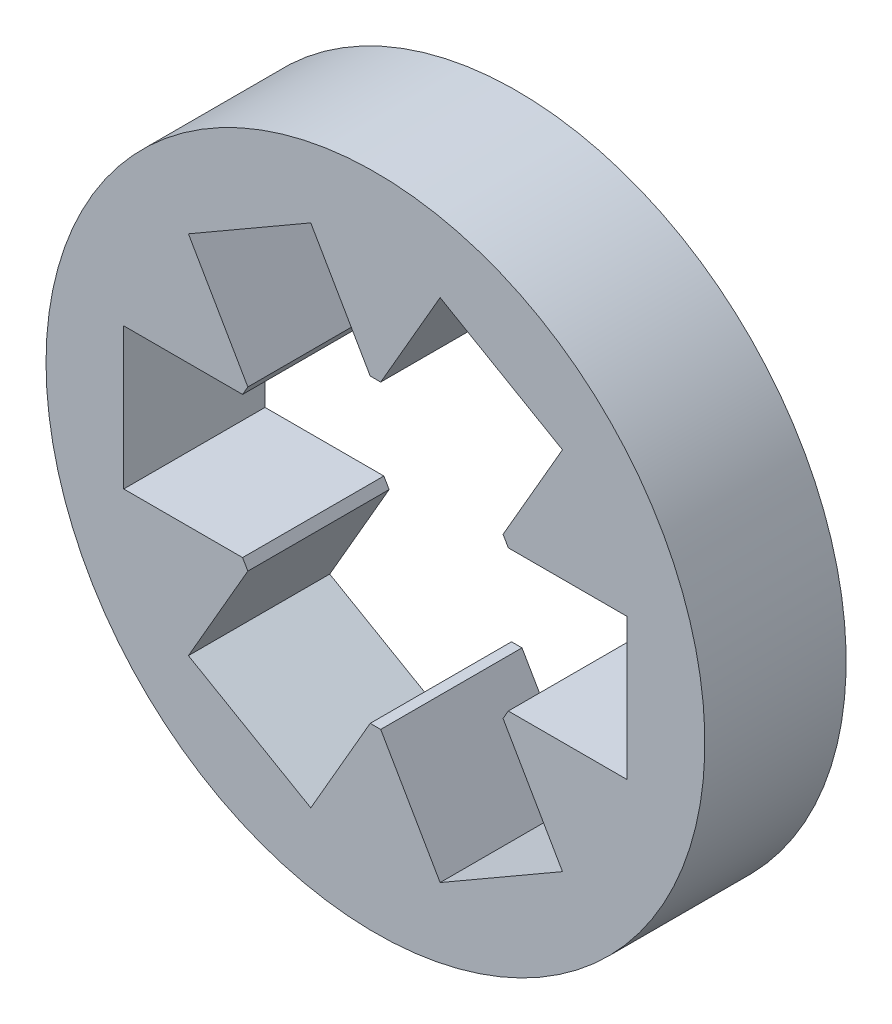
ISO-10303-21;
HEADER;
FILE_DESCRIPTION(('STEP AP214'),'2;1');
FILE_NAME('part.step','',(''),(''),'','','');
FILE_SCHEMA(('AUTOMOTIVE_DESIGN { 1 0 10303 214 1 1 1 1 }'));
ENDSEC;
DATA;
#1=APPLICATION_CONTEXT('core data for automotive mechanical design processes');
#2=APPLICATION_PROTOCOL_DEFINITION('international standard','automotive_design',2000,#1);
#3=PRODUCT_CONTEXT('',#1,'mechanical');
#4=PRODUCT('Part','Part','',(#3));
#5=PRODUCT_RELATED_PRODUCT_CATEGORY('part','',(#4));
#6=PRODUCT_DEFINITION_FORMATION('','',#4);
#7=PRODUCT_DEFINITION_CONTEXT('part definition',#1,'design');
#8=PRODUCT_DEFINITION('design','',#6,#7);
#9=PRODUCT_DEFINITION_SHAPE('','',#8);
#10=(LENGTH_UNIT() NAMED_UNIT(*) SI_UNIT(.MILLI.,.METRE.));
#11=(NAMED_UNIT(*) PLANE_ANGLE_UNIT() SI_UNIT($,.RADIAN.));
#12=(NAMED_UNIT(*) SI_UNIT($,.STERADIAN.) SOLID_ANGLE_UNIT());
#13=UNCERTAINTY_MEASURE_WITH_UNIT(LENGTH_MEASURE(1.E-05),#10,'distance_accuracy_value','');
#14=(GEOMETRIC_REPRESENTATION_CONTEXT(3) GLOBAL_UNCERTAINTY_ASSIGNED_CONTEXT((#13)) GLOBAL_UNIT_ASSIGNED_CONTEXT((#10,
#11,#12)) REPRESENTATION_CONTEXT('',''));
#15=CARTESIAN_POINT('',(0.,0.,0.));
#16=DIRECTION('',(0.,0.,1.));
#17=DIRECTION('',(1.,0.,0.));
#18=AXIS2_PLACEMENT_3D('',#15,#16,#17);
#19=CARTESIAN_POINT('',(107.492585866147,-0.762000000000165,1.524));
#20=DIRECTION('',(0.,0.,1.));
#21=DIRECTION('',(1.,0.,0.));
#22=AXIS2_PLACEMENT_3D('',#19,#20,#21);
#23=PLANE('',#22);
#24=CARTESIAN_POINT('',(107.492585866147,-0.762000000000165,1.524));
#25=DIRECTION('',(0.,0.,1.));
#26=DIRECTION('',(1.,0.,0.));
#27=AXIS2_PLACEMENT_3D('',#24,#25,#26);
#28=CIRCLE('',#27,3.55352076683496);
#29=CARTESIAN_POINT('',(103.939065099312,-0.762000000000165,1.524));
#30=VERTEX_POINT('',#29);
#31=EDGE_CURVE('E11',#30,#30,#28,.T.);
#32=ORIENTED_EDGE('',*,*,#31,.T.);
#33=EDGE_LOOP('',(#32));
#34=FACE_BOUND('',#33,.T.);
#35=DIRECTION('',(-0.500000000001559,0.866025403783539,0.));
#36=VECTOR('',#35,1.);
#37=CARTESIAN_POINT('',(108.869130968628,0.0982460564084853,1.524));
#38=LINE('',#37,#36);
#39=CARTESIAN_POINT('',(108.925853355743,0.,1.524));
#40=VERTEX_POINT('',#39);
#41=CARTESIAN_POINT('',(108.869130968628,0.0982460564084853,1.524));
#42=VERTEX_POINT('',#41);
#43=EDGE_CURVE('E199',#40,#42,#38,.T.);
#44=ORIENTED_EDGE('',*,*,#43,.F.);
#45=DIRECTION('',(-1.,0.,0.));
#46=VECTOR('',#45,1.);
#47=CARTESIAN_POINT('',(108.925853355743,0.,1.524));
#48=LINE('',#47,#46);
#49=CARTESIAN_POINT('',(110.207675722449,0.,1.524));
#50=VERTEX_POINT('',#49);
#51=EDGE_CURVE('E191',#50,#40,#48,.T.);
#52=ORIENTED_EDGE('',*,*,#51,.F.);
#53=DIRECTION('',(0.,1.,0.));
#54=VECTOR('',#53,1.);
#55=CARTESIAN_POINT('',(110.207675722449,0.,1.524));
#56=LINE('',#55,#54);
#57=CARTESIAN_POINT('',(110.207675722449,-1.52399999999999,1.524));
#58=VERTEX_POINT('',#57);
#59=EDGE_CURVE('E255',#58,#50,#56,.T.);
#60=ORIENTED_EDGE('',*,*,#59,.F.);
#61=DIRECTION('',(1.,0.,0.));
#62=VECTOR('',#61,1.);
#63=CARTESIAN_POINT('',(110.207675722449,-1.52399999999999,1.524));
#64=LINE('',#63,#62);
#65=CARTESIAN_POINT('',(108.925853355743,-1.52399999999999,1.524));
#66=VERTEX_POINT('',#65);
#67=EDGE_CURVE('E253',#66,#58,#64,.T.);
#68=ORIENTED_EDGE('',*,*,#67,.F.);
#69=DIRECTION('',(0.499999999998682,0.866025403785199,0.));
#70=VECTOR('',#69,1.);
#71=CARTESIAN_POINT('',(108.925853355743,-1.52399999999999,1.524));
#72=LINE('',#71,#70);
#73=CARTESIAN_POINT('',(108.869130968628,-1.62224605640869,1.524));
#74=VERTEX_POINT('',#73);
#75=EDGE_CURVE('E251',#74,#66,#72,.T.);
#76=ORIENTED_EDGE('',*,*,#75,.F.);
#77=DIRECTION('',(-0.499999999999997,0.866025403784441,0.));
#78=VECTOR('',#77,1.);
#79=CARTESIAN_POINT('',(108.869130968628,-1.62224605640869,1.524));
#80=LINE('',#79,#78);
#81=CARTESIAN_POINT('',(109.510042151982,-2.7323367891159,1.524));
#82=VERTEX_POINT('',#81);
#83=EDGE_CURVE('E249',#82,#74,#80,.T.);
#84=ORIENTED_EDGE('',*,*,#83,.F.);
#85=DIRECTION('',(0.866025403784439,0.499999999999999,0.));
#86=VECTOR('',#85,1.);
#87=CARTESIAN_POINT('',(109.510042151982,-2.7323367891159,1.524));
#88=LINE('',#87,#86);
#89=CARTESIAN_POINT('',(108.190219436614,-3.4943367891159,1.524));
#90=VERTEX_POINT('',#89);
#91=EDGE_CURVE('E247',#90,#82,#88,.T.);
#92=ORIENTED_EDGE('',*,*,#91,.F.);
#93=DIRECTION('',(0.499999999999997,-0.866025403784441,0.));
#94=VECTOR('',#93,1.);
#95=CARTESIAN_POINT('',(108.190219436614,-3.4943367891159,1.524));
#96=LINE('',#95,#94);
#97=CARTESIAN_POINT('',(107.549308253261,-2.38424605640869,1.524));
#98=VERTEX_POINT('',#97);
#99=EDGE_CURVE('E245',#98,#90,#96,.T.);
#100=ORIENTED_EDGE('',*,*,#99,.F.);
#101=DIRECTION('',(1.,1.59030015025616E-12,0.));
#102=VECTOR('',#101,1.);
#103=CARTESIAN_POINT('',(107.549308253261,-2.38424605640869,1.524));
#104=LINE('',#103,#102);
#105=CARTESIAN_POINT('',(107.435863479032,-2.38424605640887,1.524));
#106=VERTEX_POINT('',#105);
#107=EDGE_CURVE('E243',#106,#98,#104,.T.);
#108=ORIENTED_EDGE('',*,*,#107,.F.);
#109=DIRECTION('',(0.500000000000001,0.866025403784438,0.));
#110=VECTOR('',#109,1.);
#111=CARTESIAN_POINT('',(107.435863479032,-2.38424605640887,1.524));
#112=LINE('',#111,#110);
#113=CARTESIAN_POINT('',(106.794952295679,-3.49433678911606,1.524));
#114=VERTEX_POINT('',#113);
#115=EDGE_CURVE('E241',#114,#106,#112,.T.);
#116=ORIENTED_EDGE('',*,*,#115,.F.);
#117=DIRECTION('',(0.866025403784433,-0.50000000000001,0.));
#118=VECTOR('',#117,1.);
#119=CARTESIAN_POINT('',(106.794952295679,-3.49433678911606,1.524));
#120=LINE('',#119,#118);
#121=CARTESIAN_POINT('',(105.475129580311,-2.73233678911605,1.524));
#122=VERTEX_POINT('',#121);
#123=EDGE_CURVE('E239',#122,#114,#120,.T.);
#124=ORIENTED_EDGE('',*,*,#123,.F.);
#125=DIRECTION('',(-0.500000000000001,-0.866025403784438,0.));
#126=VECTOR('',#125,1.);
#127=CARTESIAN_POINT('',(105.475129580311,-2.73233678911605,1.524));
#128=LINE('',#127,#126);
#129=CARTESIAN_POINT('',(106.116040763665,-1.62224605640886,1.524));
#130=VERTEX_POINT('',#129);
#131=EDGE_CURVE('E237',#130,#122,#128,.T.);
#132=ORIENTED_EDGE('',*,*,#131,.F.);
#133=DIRECTION('',(0.500000000001185,-0.866025403783754,0.));
#134=VECTOR('',#133,1.);
#135=CARTESIAN_POINT('',(106.116040763665,-1.62224605640886,1.524));
#136=LINE('',#135,#134);
#137=CARTESIAN_POINT('',(106.05931837655,-1.52400000000036,1.524));
#138=VERTEX_POINT('',#137);
#139=EDGE_CURVE('E235',#138,#130,#136,.T.);
#140=ORIENTED_EDGE('',*,*,#139,.F.);
#141=DIRECTION('',(1.,0.,0.));
#142=VECTOR('',#141,1.);
#143=CARTESIAN_POINT('',(106.05931837655,-1.52400000000036,1.524));
#144=LINE('',#143,#142);
#145=CARTESIAN_POINT('',(104.777496009844,-1.52400000000037,1.524));
#146=VERTEX_POINT('',#145);
#147=EDGE_CURVE('E233',#146,#138,#144,.T.);
#148=ORIENTED_EDGE('',*,*,#147,.F.);
#149=DIRECTION('',(0.,-1.,0.));
#150=VECTOR('',#149,1.);
#151=CARTESIAN_POINT('',(104.777496009844,-1.52400000000037,1.524));
#152=LINE('',#151,#150);
#153=CARTESIAN_POINT('',(104.777496009844,-3.64725610824124E-13,1.524));
#154=VERTEX_POINT('',#153);
#155=EDGE_CURVE('E231',#154,#146,#152,.T.);
#156=ORIENTED_EDGE('',*,*,#155,.F.);
#157=DIRECTION('',(-1.,0.,0.));
#158=VECTOR('',#157,1.);
#159=CARTESIAN_POINT('',(104.777496009844,-3.64725610824124E-13,1.524));
#160=LINE('',#159,#158);
#161=CARTESIAN_POINT('',(106.05931837655,-3.55618312575245E-13,1.524));
#162=VERTEX_POINT('',#161);
#163=EDGE_CURVE('E229',#162,#154,#160,.T.);
#164=ORIENTED_EDGE('',*,*,#163,.F.);
#165=DIRECTION('',(-0.499999999998743,-0.866025403785164,0.));
#166=VECTOR('',#165,1.);
#167=CARTESIAN_POINT('',(106.05931837655,-3.55618312575245E-13,1.524));
#168=LINE('',#167,#166);
#169=CARTESIAN_POINT('',(106.116040763665,0.0982460564083049,1.524));
#170=VERTEX_POINT('',#169);
#171=EDGE_CURVE('E227',#170,#162,#168,.T.);
#172=ORIENTED_EDGE('',*,*,#171,.F.);
#173=DIRECTION('',(0.500000000000001,-0.866025403784438,0.));
#174=VECTOR('',#173,1.);
#175=CARTESIAN_POINT('',(106.116040763665,0.0982460564083049,1.524));
#176=LINE('',#175,#174);
#177=CARTESIAN_POINT('',(105.475129580311,1.2083367891155,1.524));
#178=VERTEX_POINT('',#177);
#179=EDGE_CURVE('E225',#178,#170,#176,.T.);
#180=ORIENTED_EDGE('',*,*,#179,.F.);
#181=DIRECTION('',(-0.866025403784435,-0.500000000000006,0.));
#182=VECTOR('',#181,1.);
#183=CARTESIAN_POINT('',(105.475129580311,1.2083367891155,1.524));
#184=LINE('',#183,#182);
#185=CARTESIAN_POINT('',(106.794952295679,1.97033678911551,1.524));
#186=VERTEX_POINT('',#185);
#187=EDGE_CURVE('E223',#186,#178,#184,.T.);
#188=ORIENTED_EDGE('',*,*,#187,.F.);
#189=DIRECTION('',(-0.500000000000001,0.866025403784438,0.));
#190=VECTOR('',#189,1.);
#191=CARTESIAN_POINT('',(106.794952295679,1.97033678911551,1.524));
#192=LINE('',#191,#190);
#193=CARTESIAN_POINT('',(107.435863479032,0.860246056408318,1.524));
#194=VERTEX_POINT('',#193);
#195=EDGE_CURVE('E221',#194,#186,#192,.T.);
#196=ORIENTED_EDGE('',*,*,#195,.F.);
#197=DIRECTION('',(-1.,-1.46796936946758E-12,0.));
#198=VECTOR('',#197,1.);
#199=CARTESIAN_POINT('',(107.435863479032,0.860246056408318,1.524));
#200=LINE('',#199,#198);
#201=CARTESIAN_POINT('',(107.549308253261,0.860246056408484,1.524));
#202=VERTEX_POINT('',#201);
#203=EDGE_CURVE('E219',#202,#194,#200,.T.);
#204=ORIENTED_EDGE('',*,*,#203,.F.);
#205=DIRECTION('',(-0.499999999999997,-0.866025403784441,0.));
#206=VECTOR('',#205,1.);
#207=CARTESIAN_POINT('',(107.549308253261,0.860246056408484,1.524));
#208=LINE('',#207,#206);
#209=CARTESIAN_POINT('',(108.190219436614,1.97033678911569,1.524));
#210=VERTEX_POINT('',#209);
#211=EDGE_CURVE('E217',#210,#202,#208,.T.);
#212=ORIENTED_EDGE('',*,*,#211,.F.);
#213=DIRECTION('',(-0.866025403784439,0.499999999999999,0.));
#214=VECTOR('',#213,1.);
#215=CARTESIAN_POINT('',(108.190219436614,1.97033678911569,1.524));
#216=LINE('',#215,#214);
#217=CARTESIAN_POINT('',(109.510042151982,1.20833678911569,1.524));
#218=VERTEX_POINT('',#217);
#219=EDGE_CURVE('E213',#218,#210,#216,.T.);
#220=ORIENTED_EDGE('',*,*,#219,.F.);
#221=DIRECTION('',(0.499999999999997,0.866025403784441,0.));
#222=VECTOR('',#221,1.);
#223=CARTESIAN_POINT('',(109.510042151982,1.20833678911569,1.524));
#224=LINE('',#223,#222);
#225=EDGE_CURVE('E211',#42,#218,#224,.T.);
#226=ORIENTED_EDGE('',*,*,#225,.F.);
#227=EDGE_LOOP('',(#44,#52,#60,#68,#76,#84,#92,#100,#108,#116,#124,#132,#140,#148,#156,#164,
#172,#180,#188,#196,#204,#212,#220,#226));
#228=FACE_BOUND('',#227,.T.);
#229=ADVANCED_FACE('F30',(#34,#228),#23,.T.);
#230=CARTESIAN_POINT('',(107.492585866147,-0.762000000000165,0.));
#231=DIRECTION('',(0.,0.,1.));
#232=DIRECTION('',(1.,0.,0.));
#233=AXIS2_PLACEMENT_3D('',#230,#231,#232);
#234=PLANE('',#233);
#235=CARTESIAN_POINT('',(107.492585866147,-0.762000000000165,0.));
#236=DIRECTION('',(0.,0.,1.));
#237=DIRECTION('',(1.,0.,0.));
#238=AXIS2_PLACEMENT_3D('',#235,#236,#237);
#239=CIRCLE('',#238,3.55352076683496);
#240=CARTESIAN_POINT('',(103.939065099312,-0.762000000000165,0.));
#241=VERTEX_POINT('',#240);
#242=EDGE_CURVE('E34',#241,#241,#239,.T.);
#243=ORIENTED_EDGE('',*,*,#242,.F.);
#244=EDGE_LOOP('',(#243));
#245=FACE_BOUND('',#244,.T.);
#246=DIRECTION('',(-1.,0.,0.));
#247=VECTOR('',#246,1.);
#248=CARTESIAN_POINT('',(108.925853355743,0.,0.));
#249=LINE('',#248,#247);
#250=CARTESIAN_POINT('',(110.207675722449,0.,0.));
#251=VERTEX_POINT('',#250);
#252=CARTESIAN_POINT('',(108.925853355743,0.,0.));
#253=VERTEX_POINT('',#252);
#254=EDGE_CURVE('E53',#251,#253,#249,.T.);
#255=ORIENTED_EDGE('',*,*,#254,.T.);
#256=DIRECTION('',(-0.500000000001559,0.866025403783539,0.));
#257=VECTOR('',#256,1.);
#258=CARTESIAN_POINT('',(108.869130968628,0.0982460564084853,0.));
#259=LINE('',#258,#257);
#260=CARTESIAN_POINT('',(108.869130968628,0.0982460564084853,0.));
#261=VERTEX_POINT('',#260);
#262=EDGE_CURVE('E206',#253,#261,#259,.T.);
#263=ORIENTED_EDGE('',*,*,#262,.T.);
#264=DIRECTION('',(0.499999999999997,0.866025403784441,0.));
#265=VECTOR('',#264,1.);
#266=CARTESIAN_POINT('',(109.510042151982,1.20833678911569,0.));
#267=LINE('',#266,#265);
#268=CARTESIAN_POINT('',(109.510042151982,1.20833678911569,0.));
#269=VERTEX_POINT('',#268);
#270=EDGE_CURVE('E259',#261,#269,#267,.T.);
#271=ORIENTED_EDGE('',*,*,#270,.T.);
#272=DIRECTION('',(-0.866025403784439,0.499999999999999,0.));
#273=VECTOR('',#272,1.);
#274=CARTESIAN_POINT('',(108.190219436614,1.97033678911569,0.));
#275=LINE('',#274,#273);
#276=CARTESIAN_POINT('',(108.190219436614,1.97033678911569,0.));
#277=VERTEX_POINT('',#276);
#278=EDGE_CURVE('E262',#269,#277,#275,.T.);
#279=ORIENTED_EDGE('',*,*,#278,.T.);
#280=DIRECTION('',(-0.499999999999997,-0.866025403784441,0.));
#281=VECTOR('',#280,1.);
#282=CARTESIAN_POINT('',(107.549308253261,0.860246056408484,0.));
#283=LINE('',#282,#281);
#284=CARTESIAN_POINT('',(107.549308253261,0.860246056408484,0.));
#285=VERTEX_POINT('',#284);
#286=EDGE_CURVE('E265',#277,#285,#283,.T.);
#287=ORIENTED_EDGE('',*,*,#286,.T.);
#288=DIRECTION('',(-1.,-1.46796936946758E-12,0.));
#289=VECTOR('',#288,1.);
#290=CARTESIAN_POINT('',(107.435863479032,0.860246056408318,0.));
#291=LINE('',#290,#289);
#292=CARTESIAN_POINT('',(107.435863479032,0.860246056408318,0.));
#293=VERTEX_POINT('',#292);
#294=EDGE_CURVE('E268',#285,#293,#291,.T.);
#295=ORIENTED_EDGE('',*,*,#294,.T.);
#296=DIRECTION('',(-0.500000000000001,0.866025403784438,0.));
#297=VECTOR('',#296,1.);
#298=CARTESIAN_POINT('',(106.794952295679,1.97033678911551,0.));
#299=LINE('',#298,#297);
#300=CARTESIAN_POINT('',(106.794952295679,1.97033678911551,0.));
#301=VERTEX_POINT('',#300);
#302=EDGE_CURVE('E271',#293,#301,#299,.T.);
#303=ORIENTED_EDGE('',*,*,#302,.T.);
#304=DIRECTION('',(-0.866025403784435,-0.500000000000006,0.));
#305=VECTOR('',#304,1.);
#306=CARTESIAN_POINT('',(105.475129580311,1.2083367891155,0.));
#307=LINE('',#306,#305);
#308=CARTESIAN_POINT('',(105.475129580311,1.2083367891155,0.));
#309=VERTEX_POINT('',#308);
#310=EDGE_CURVE('E274',#301,#309,#307,.T.);
#311=ORIENTED_EDGE('',*,*,#310,.T.);
#312=DIRECTION('',(0.500000000000001,-0.866025403784438,0.));
#313=VECTOR('',#312,1.);
#314=CARTESIAN_POINT('',(106.116040763665,0.0982460564083049,0.));
#315=LINE('',#314,#313);
#316=CARTESIAN_POINT('',(106.116040763665,0.0982460564083049,0.));
#317=VERTEX_POINT('',#316);
#318=EDGE_CURVE('E277',#309,#317,#315,.T.);
#319=ORIENTED_EDGE('',*,*,#318,.T.);
#320=DIRECTION('',(-0.499999999998743,-0.866025403785164,0.));
#321=VECTOR('',#320,1.);
#322=CARTESIAN_POINT('',(106.05931837655,-3.55618312575245E-13,0.));
#323=LINE('',#322,#321);
#324=CARTESIAN_POINT('',(106.05931837655,-3.55618312575245E-13,0.));
#325=VERTEX_POINT('',#324);
#326=EDGE_CURVE('E280',#317,#325,#323,.T.);
#327=ORIENTED_EDGE('',*,*,#326,.T.);
#328=DIRECTION('',(-1.,0.,0.));
#329=VECTOR('',#328,1.);
#330=CARTESIAN_POINT('',(104.777496009844,-3.64725610824124E-13,0.));
#331=LINE('',#330,#329);
#332=CARTESIAN_POINT('',(104.777496009844,-3.64725610824124E-13,0.));
#333=VERTEX_POINT('',#332);
#334=EDGE_CURVE('E283',#325,#333,#331,.T.);
#335=ORIENTED_EDGE('',*,*,#334,.T.);
#336=DIRECTION('',(0.,-1.,0.));
#337=VECTOR('',#336,1.);
#338=CARTESIAN_POINT('',(104.777496009844,-1.52400000000037,0.));
#339=LINE('',#338,#337);
#340=CARTESIAN_POINT('',(104.777496009844,-1.52400000000037,0.));
#341=VERTEX_POINT('',#340);
#342=EDGE_CURVE('E286',#333,#341,#339,.T.);
#343=ORIENTED_EDGE('',*,*,#342,.T.);
#344=DIRECTION('',(1.,0.,0.));
#345=VECTOR('',#344,1.);
#346=CARTESIAN_POINT('',(106.05931837655,-1.52400000000036,0.));
#347=LINE('',#346,#345);
#348=CARTESIAN_POINT('',(106.05931837655,-1.52400000000036,0.));
#349=VERTEX_POINT('',#348);
#350=EDGE_CURVE('E289',#341,#349,#347,.T.);
#351=ORIENTED_EDGE('',*,*,#350,.T.);
#352=DIRECTION('',(0.500000000001185,-0.866025403783754,0.));
#353=VECTOR('',#352,1.);
#354=CARTESIAN_POINT('',(106.116040763665,-1.62224605640886,0.));
#355=LINE('',#354,#353);
#356=CARTESIAN_POINT('',(106.116040763665,-1.62224605640886,0.));
#357=VERTEX_POINT('',#356);
#358=EDGE_CURVE('E292',#349,#357,#355,.T.);
#359=ORIENTED_EDGE('',*,*,#358,.T.);
#360=DIRECTION('',(-0.500000000000001,-0.866025403784438,0.));
#361=VECTOR('',#360,1.);
#362=CARTESIAN_POINT('',(105.475129580311,-2.73233678911605,0.));
#363=LINE('',#362,#361);
#364=CARTESIAN_POINT('',(105.475129580311,-2.73233678911605,0.));
#365=VERTEX_POINT('',#364);
#366=EDGE_CURVE('E295',#357,#365,#363,.T.);
#367=ORIENTED_EDGE('',*,*,#366,.T.);
#368=DIRECTION('',(0.866025403784433,-0.50000000000001,0.));
#369=VECTOR('',#368,1.);
#370=CARTESIAN_POINT('',(106.794952295679,-3.49433678911606,0.));
#371=LINE('',#370,#369);
#372=CARTESIAN_POINT('',(106.794952295679,-3.49433678911606,0.));
#373=VERTEX_POINT('',#372);
#374=EDGE_CURVE('E298',#365,#373,#371,.T.);
#375=ORIENTED_EDGE('',*,*,#374,.T.);
#376=DIRECTION('',(0.500000000000001,0.866025403784438,0.));
#377=VECTOR('',#376,1.);
#378=CARTESIAN_POINT('',(107.435863479032,-2.38424605640887,0.));
#379=LINE('',#378,#377);
#380=CARTESIAN_POINT('',(107.435863479032,-2.38424605640887,0.));
#381=VERTEX_POINT('',#380);
#382=EDGE_CURVE('E301',#373,#381,#379,.T.);
#383=ORIENTED_EDGE('',*,*,#382,.T.);
#384=DIRECTION('',(1.,1.59030015025616E-12,0.));
#385=VECTOR('',#384,1.);
#386=CARTESIAN_POINT('',(107.549308253261,-2.38424605640869,0.));
#387=LINE('',#386,#385);
#388=CARTESIAN_POINT('',(107.549308253261,-2.38424605640869,0.));
#389=VERTEX_POINT('',#388);
#390=EDGE_CURVE('E304',#381,#389,#387,.T.);
#391=ORIENTED_EDGE('',*,*,#390,.T.);
#392=DIRECTION('',(0.499999999999997,-0.866025403784441,0.));
#393=VECTOR('',#392,1.);
#394=CARTESIAN_POINT('',(108.190219436614,-3.4943367891159,0.));
#395=LINE('',#394,#393);
#396=CARTESIAN_POINT('',(108.190219436614,-3.4943367891159,0.));
#397=VERTEX_POINT('',#396);
#398=EDGE_CURVE('E307',#389,#397,#395,.T.);
#399=ORIENTED_EDGE('',*,*,#398,.T.);
#400=DIRECTION('',(0.866025403784439,0.499999999999999,0.));
#401=VECTOR('',#400,1.);
#402=CARTESIAN_POINT('',(109.510042151982,-2.7323367891159,0.));
#403=LINE('',#402,#401);
#404=CARTESIAN_POINT('',(109.510042151982,-2.7323367891159,0.));
#405=VERTEX_POINT('',#404);
#406=EDGE_CURVE('E310',#397,#405,#403,.T.);
#407=ORIENTED_EDGE('',*,*,#406,.T.);
#408=DIRECTION('',(-0.499999999999997,0.866025403784441,0.));
#409=VECTOR('',#408,1.);
#410=CARTESIAN_POINT('',(108.869130968628,-1.62224605640869,0.));
#411=LINE('',#410,#409);
#412=CARTESIAN_POINT('',(108.869130968628,-1.62224605640869,0.));
#413=VERTEX_POINT('',#412);
#414=EDGE_CURVE('E313',#405,#413,#411,.T.);
#415=ORIENTED_EDGE('',*,*,#414,.T.);
#416=DIRECTION('',(0.499999999998682,0.866025403785199,0.));
#417=VECTOR('',#416,1.);
#418=CARTESIAN_POINT('',(108.925853355743,-1.52399999999999,0.));
#419=LINE('',#418,#417);
#420=CARTESIAN_POINT('',(108.925853355743,-1.52399999999999,0.));
#421=VERTEX_POINT('',#420);
#422=EDGE_CURVE('E316',#413,#421,#419,.T.);
#423=ORIENTED_EDGE('',*,*,#422,.T.);
#424=DIRECTION('',(1.,0.,0.));
#425=VECTOR('',#424,1.);
#426=CARTESIAN_POINT('',(110.207675722449,-1.52399999999999,0.));
#427=LINE('',#426,#425);
#428=CARTESIAN_POINT('',(110.207675722449,-1.52399999999999,0.));
#429=VERTEX_POINT('',#428);
#430=EDGE_CURVE('E319',#421,#429,#427,.T.);
#431=ORIENTED_EDGE('',*,*,#430,.T.);
#432=DIRECTION('',(0.,1.,0.));
#433=VECTOR('',#432,1.);
#434=CARTESIAN_POINT('',(110.207675722449,0.,0.));
#435=LINE('',#434,#433);
#436=EDGE_CURVE('E200',#429,#251,#435,.T.);
#437=ORIENTED_EDGE('',*,*,#436,.T.);
#438=EDGE_LOOP('',(#255,#263,#271,#279,#287,#295,#303,#311,#319,#327,#335,#343,#351,#359,#367,
#375,#383,#391,#399,#407,#415,#423,#431,#437));
#439=FACE_BOUND('',#438,.T.);
#440=ADVANCED_FACE('F372',(#245,#439),#234,.F.);
#441=CARTESIAN_POINT('',(107.492585866147,-0.762000000000165,1.524));
#442=DIRECTION('',(0.,0.,-1.));
#443=DIRECTION('',(-1.,0.,0.));
#444=AXIS2_PLACEMENT_3D('',#441,#442,#443);
#445=CYLINDRICAL_SURFACE('',#444,3.55352076683496);
#446=CARTESIAN_POINT('',(103.939065099312,-0.762000000000165,1.524));
#447=CARTESIAN_POINT('',(103.939065099312,-0.762000000000165,1.508125));
#448=CARTESIAN_POINT('',(103.939065099312,-0.762000000000165,1.49225));
#449=CARTESIAN_POINT('',(103.939065099312,-0.762000000000165,1.4605));
#450=CARTESIAN_POINT('',(103.939065099312,-0.762000000000165,1.444625));
#451=CARTESIAN_POINT('',(103.939065099312,-0.762000000000165,1.412875));
#452=CARTESIAN_POINT('',(103.939065099312,-0.762000000000165,1.397));
#453=CARTESIAN_POINT('',(103.939065099312,-0.762000000000165,1.36525));
#454=CARTESIAN_POINT('',(103.939065099312,-0.762000000000165,1.349375));
#455=CARTESIAN_POINT('',(103.939065099312,-0.762000000000165,1.317625));
#456=CARTESIAN_POINT('',(103.939065099312,-0.762000000000165,1.30175));
#457=CARTESIAN_POINT('',(103.939065099312,-0.762000000000165,1.27));
#458=CARTESIAN_POINT('',(103.939065099312,-0.762000000000165,1.254125));
#459=CARTESIAN_POINT('',(103.939065099312,-0.762000000000165,1.222375));
#460=CARTESIAN_POINT('',(103.939065099312,-0.762000000000165,1.2065));
#461=CARTESIAN_POINT('',(103.939065099312,-0.762000000000165,1.17475));
#462=CARTESIAN_POINT('',(103.939065099312,-0.762000000000165,1.158875));
#463=CARTESIAN_POINT('',(103.939065099312,-0.762000000000165,1.127125));
#464=CARTESIAN_POINT('',(103.939065099312,-0.762000000000165,1.11125));
#465=CARTESIAN_POINT('',(103.939065099312,-0.762000000000165,1.0795));
#466=CARTESIAN_POINT('',(103.939065099312,-0.762000000000165,1.063625));
#467=CARTESIAN_POINT('',(103.939065099312,-0.762000000000165,1.031875));
#468=CARTESIAN_POINT('',(103.939065099312,-0.762000000000165,1.016));
#469=CARTESIAN_POINT('',(103.939065099312,-0.762000000000165,0.98425));
#470=CARTESIAN_POINT('',(103.939065099312,-0.762000000000165,0.968375));
#471=CARTESIAN_POINT('',(103.939065099312,-0.762000000000165,0.936625));
#472=CARTESIAN_POINT('',(103.939065099312,-0.762000000000165,0.92075));
#473=CARTESIAN_POINT('',(103.939065099312,-0.762000000000165,0.889));
#474=CARTESIAN_POINT('',(103.939065099312,-0.762000000000165,0.873125));
#475=CARTESIAN_POINT('',(103.939065099312,-0.762000000000165,0.841375));
#476=CARTESIAN_POINT('',(103.939065099312,-0.762000000000165,0.8255));
#477=CARTESIAN_POINT('',(103.939065099312,-0.762000000000165,0.79375));
#478=CARTESIAN_POINT('',(103.939065099312,-0.762000000000165,0.777875));
#479=CARTESIAN_POINT('',(103.939065099312,-0.762000000000165,0.746125));
#480=CARTESIAN_POINT('',(103.939065099312,-0.762000000000165,0.73025));
#481=CARTESIAN_POINT('',(103.939065099312,-0.762000000000165,0.6985));
#482=CARTESIAN_POINT('',(103.939065099312,-0.762000000000165,0.682625));
#483=CARTESIAN_POINT('',(103.939065099312,-0.762000000000165,0.650875));
#484=CARTESIAN_POINT('',(103.939065099312,-0.762000000000165,0.635));
#485=CARTESIAN_POINT('',(103.939065099312,-0.762000000000165,0.60325));
#486=CARTESIAN_POINT('',(103.939065099312,-0.762000000000165,0.587375));
#487=CARTESIAN_POINT('',(103.939065099312,-0.762000000000165,0.555625));
#488=CARTESIAN_POINT('',(103.939065099312,-0.762000000000165,0.53975));
#489=CARTESIAN_POINT('',(103.939065099312,-0.762000000000165,0.508));
#490=CARTESIAN_POINT('',(103.939065099312,-0.762000000000165,0.492125));
#491=CARTESIAN_POINT('',(103.939065099312,-0.762000000000165,0.460375));
#492=CARTESIAN_POINT('',(103.939065099312,-0.762000000000165,0.4445));
#493=CARTESIAN_POINT('',(103.939065099312,-0.762000000000165,0.41275));
#494=CARTESIAN_POINT('',(103.939065099312,-0.762000000000165,0.396875));
#495=CARTESIAN_POINT('',(103.939065099312,-0.762000000000165,0.365125));
#496=CARTESIAN_POINT('',(103.939065099312,-0.762000000000165,0.34925));
#497=CARTESIAN_POINT('',(103.939065099312,-0.762000000000165,0.3175));
#498=CARTESIAN_POINT('',(103.939065099312,-0.762000000000165,0.301625));
#499=CARTESIAN_POINT('',(103.939065099312,-0.762000000000165,0.269875));
#500=CARTESIAN_POINT('',(103.939065099312,-0.762000000000165,0.254));
#501=CARTESIAN_POINT('',(103.939065099312,-0.762000000000165,0.22225));
#502=CARTESIAN_POINT('',(103.939065099312,-0.762000000000165,0.206375));
#503=CARTESIAN_POINT('',(103.939065099312,-0.762000000000165,0.174625));
#504=CARTESIAN_POINT('',(103.939065099312,-0.762000000000165,0.15875));
#505=CARTESIAN_POINT('',(103.939065099312,-0.762000000000165,0.127));
#506=CARTESIAN_POINT('',(103.939065099312,-0.762000000000165,0.111125));
#507=CARTESIAN_POINT('',(103.939065099312,-0.762000000000165,0.079375));
#508=CARTESIAN_POINT('',(103.939065099312,-0.762000000000165,0.0635));
#509=CARTESIAN_POINT('',(103.939065099312,-0.762000000000165,0.0317499999999999));
#510=CARTESIAN_POINT('',(103.939065099312,-0.762000000000165,0.015875));
#511=CARTESIAN_POINT('',(103.939065099312,-0.762000000000165,0.));
#512=B_SPLINE_CURVE_WITH_KNOTS('',3,(#446,#447,#448,#449,#450,#451,#452,#453,#454,#455,#456,
#457,#458,#459,#460,#461,#462,#463,#464,#465,#466,#467,#468,#469,#470,#471,#472,#473,#474,#475,
#476,#477,#478,#479,#480,#481,#482,#483,#484,#485,#486,#487,#488,#489,#490,#491,#492,#493,#494,
#495,#496,#497,#498,#499,#500,#501,#502,#503,#504,#505,#506,#507,#508,#509,#510,#511),
.UNSPECIFIED.,.F.,.F.,(4,2,2,2,2,2,2,2,2,2,2,2,2,2,2,2,2,2,2,2,2,2,2,2,2,2,2,2,2,2,2,2,4),(0.,
0.0476250000000001,0.0952500000000001,0.142875,0.1905,0.238125,0.28575,0.333375,0.381,0.428625,
0.47625,0.523875,0.5715,0.619125,0.66675,0.714375,0.762,0.809625,0.85725,0.904875,0.9525,
1.000125,1.04775,1.095375,1.143,1.190625,1.23825,1.285875,1.3335,1.381125,1.42875,1.476375,
1.524),.UNSPECIFIED.);
#513=EDGE_CURVE('BSEAM32',#30,#241,#512,.T.);
#514=ORIENTED_EDGE('',*,*,#31,.F.);
#515=ORIENTED_EDGE('',*,*,#242,.T.);
#516=ORIENTED_EDGE('',*,*,#513,.T.);
#517=ORIENTED_EDGE('',*,*,#513,.F.);
#518=EDGE_LOOP('',(#514,#516,#515,#517));
#519=FACE_BOUND('',#518,.T.);
#520=ADVANCED_FACE('F32',(#519),#445,.T.);
#521=CARTESIAN_POINT('',(108.925853355743,0.,1.524));
#522=DIRECTION('',(0.,-1.,0.));
#523=DIRECTION('',(1.,0.,0.));
#524=AXIS2_PLACEMENT_3D('',#521,#522,#523);
#525=PLANE('',#524);
#526=ORIENTED_EDGE('',*,*,#254,.F.);
#527=DIRECTION('',(0.,0.,-1.));
#528=VECTOR('',#527,1.);
#529=CARTESIAN_POINT('',(110.207675722449,0.,1.524));
#530=LINE('',#529,#528);
#531=EDGE_CURVE('E195',#50,#251,#530,.T.);
#532=ORIENTED_EDGE('',*,*,#531,.F.);
#533=ORIENTED_EDGE('',*,*,#51,.T.);
#534=DIRECTION('',(0.,0.,-1.));
#535=VECTOR('',#534,1.);
#536=CARTESIAN_POINT('',(108.925853355743,0.,1.524));
#537=LINE('',#536,#535);
#538=EDGE_CURVE('E194',#40,#253,#537,.T.);
#539=ORIENTED_EDGE('',*,*,#538,.T.);
#540=EDGE_LOOP('',(#526,#532,#533,#539));
#541=FACE_BOUND('',#540,.T.);
#542=ADVANCED_FACE('F193',(#541),#525,.T.);
#543=CARTESIAN_POINT('',(108.869130968628,0.0982460564084853,1.524));
#544=DIRECTION('',(-0.866025403783539,-0.500000000001559,0.));
#545=DIRECTION('',(0.500000000001559,-0.866025403783539,0.));
#546=AXIS2_PLACEMENT_3D('',#543,#544,#545);
#547=PLANE('',#546);
#548=ORIENTED_EDGE('',*,*,#262,.F.);
#549=ORIENTED_EDGE('',*,*,#538,.F.);
#550=ORIENTED_EDGE('',*,*,#43,.T.);
#551=DIRECTION('',(0.,0.,-1.));
#552=VECTOR('',#551,1.);
#553=CARTESIAN_POINT('',(108.869130968628,0.0982460564084853,1.524));
#554=LINE('',#553,#552);
#555=EDGE_CURVE('E207',#42,#261,#554,.T.);
#556=ORIENTED_EDGE('',*,*,#555,.T.);
#557=EDGE_LOOP('',(#548,#549,#550,#556));
#558=FACE_BOUND('',#557,.T.);
#559=ADVANCED_FACE('F203',(#558),#547,.T.);
#560=CARTESIAN_POINT('',(109.510042151982,1.20833678911569,1.524));
#561=DIRECTION('',(-0.866025403784441,0.499999999999996,0.));
#562=DIRECTION('',(-0.499999999999997,-0.866025403784441,0.));
#563=AXIS2_PLACEMENT_3D('',#560,#561,#562);
#564=PLANE('',#563);
#565=ORIENTED_EDGE('',*,*,#270,.F.);
#566=ORIENTED_EDGE('',*,*,#555,.F.);
#567=ORIENTED_EDGE('',*,*,#225,.T.);
#568=DIRECTION('',(0.,0.,-1.));
#569=VECTOR('',#568,1.);
#570=CARTESIAN_POINT('',(109.510042151982,1.20833678911569,1.524));
#571=LINE('',#570,#569);
#572=EDGE_CURVE('E364',#218,#269,#571,.T.);
#573=ORIENTED_EDGE('',*,*,#572,.T.);
#574=EDGE_LOOP('',(#565,#566,#567,#573));
#575=FACE_BOUND('',#574,.T.);
#576=ADVANCED_FACE('F368',(#575),#564,.T.);
#577=CARTESIAN_POINT('',(108.190219436614,1.97033678911569,1.524));
#578=DIRECTION('',(-0.499999999999999,-0.866025403784439,0.));
#579=DIRECTION('',(0.866025403784439,-0.499999999999999,0.));
#580=AXIS2_PLACEMENT_3D('',#577,#578,#579);
#581=PLANE('',#580);
#582=ORIENTED_EDGE('',*,*,#278,.F.);
#583=ORIENTED_EDGE('',*,*,#572,.F.);
#584=ORIENTED_EDGE('',*,*,#219,.T.);
#585=DIRECTION('',(0.,0.,-1.));
#586=VECTOR('',#585,1.);
#587=CARTESIAN_POINT('',(108.190219436614,1.97033678911569,1.524));
#588=LINE('',#587,#586);
#589=EDGE_CURVE('E362',#210,#277,#588,.T.);
#590=ORIENTED_EDGE('',*,*,#589,.T.);
#591=EDGE_LOOP('',(#582,#583,#584,#590));
#592=FACE_BOUND('',#591,.T.);
#593=ADVANCED_FACE('F470',(#592),#581,.T.);
#594=CARTESIAN_POINT('',(107.549308253261,0.860246056408484,1.524));
#595=DIRECTION('',(0.866025403784441,-0.499999999999996,0.));
#596=DIRECTION('',(0.499999999999997,0.866025403784441,0.));
#597=AXIS2_PLACEMENT_3D('',#594,#595,#596);
#598=PLANE('',#597);
#599=ORIENTED_EDGE('',*,*,#286,.F.);
#600=ORIENTED_EDGE('',*,*,#589,.F.);
#601=ORIENTED_EDGE('',*,*,#211,.T.);
#602=DIRECTION('',(0.,0.,-1.));
#603=VECTOR('',#602,1.);
#604=CARTESIAN_POINT('',(107.549308253261,0.860246056408484,1.524));
#605=LINE('',#604,#603);
#606=EDGE_CURVE('E360',#202,#285,#605,.T.);
#607=ORIENTED_EDGE('',*,*,#606,.T.);
#608=EDGE_LOOP('',(#599,#600,#601,#607));
#609=FACE_BOUND('',#608,.T.);
#610=ADVANCED_FACE('F468',(#609),#598,.T.);
#611=CARTESIAN_POINT('',(107.435863479032,0.860246056408318,1.524));
#612=DIRECTION('',(1.46796936946758E-12,-1.,0.));
#613=DIRECTION('',(1.,1.46796936946758E-12,0.));
#614=AXIS2_PLACEMENT_3D('',#611,#612,#613);
#615=PLANE('',#614);
#616=ORIENTED_EDGE('',*,*,#294,.F.);
#617=ORIENTED_EDGE('',*,*,#606,.F.);
#618=ORIENTED_EDGE('',*,*,#203,.T.);
#619=DIRECTION('',(0.,0.,-1.));
#620=VECTOR('',#619,1.);
#621=CARTESIAN_POINT('',(107.435863479032,0.860246056408318,1.524));
#622=LINE('',#621,#620);
#623=EDGE_CURVE('E358',#194,#293,#622,.T.);
#624=ORIENTED_EDGE('',*,*,#623,.T.);
#625=EDGE_LOOP('',(#616,#617,#618,#624));
#626=FACE_BOUND('',#625,.T.);
#627=ADVANCED_FACE('F462',(#626),#615,.T.);
#628=CARTESIAN_POINT('',(106.794952295679,1.97033678911551,1.524));
#629=DIRECTION('',(-0.866025403784438,-0.500000000000001,0.));
#630=DIRECTION('',(0.500000000000001,-0.866025403784438,0.));
#631=AXIS2_PLACEMENT_3D('',#628,#629,#630);
#632=PLANE('',#631);
#633=ORIENTED_EDGE('',*,*,#302,.F.);
#634=ORIENTED_EDGE('',*,*,#623,.F.);
#635=ORIENTED_EDGE('',*,*,#195,.T.);
#636=DIRECTION('',(0.,0.,-1.));
#637=VECTOR('',#636,1.);
#638=CARTESIAN_POINT('',(106.794952295679,1.97033678911551,1.524));
#639=LINE('',#638,#637);
#640=EDGE_CURVE('E356',#186,#301,#639,.T.);
#641=ORIENTED_EDGE('',*,*,#640,.T.);
#642=EDGE_LOOP('',(#633,#634,#635,#641));
#643=FACE_BOUND('',#642,.T.);
#644=ADVANCED_FACE('F458',(#643),#632,.T.);
#645=CARTESIAN_POINT('',(105.475129580311,1.2083367891155,1.524));
#646=DIRECTION('',(0.500000000000006,-0.866025403784435,0.));
#647=DIRECTION('',(0.866025403784435,0.500000000000006,0.));
#648=AXIS2_PLACEMENT_3D('',#645,#646,#647);
#649=PLANE('',#648);
#650=ORIENTED_EDGE('',*,*,#310,.F.);
#651=ORIENTED_EDGE('',*,*,#640,.F.);
#652=ORIENTED_EDGE('',*,*,#187,.T.);
#653=DIRECTION('',(0.,0.,-1.));
#654=VECTOR('',#653,1.);
#655=CARTESIAN_POINT('',(105.475129580311,1.2083367891155,1.524));
#656=LINE('',#655,#654);
#657=EDGE_CURVE('E354',#178,#309,#656,.T.);
#658=ORIENTED_EDGE('',*,*,#657,.T.);
#659=EDGE_LOOP('',(#650,#651,#652,#658));
#660=FACE_BOUND('',#659,.T.);
#661=ADVANCED_FACE('F455',(#660),#649,.T.);
#662=CARTESIAN_POINT('',(106.116040763665,0.0982460564083049,1.524));
#663=DIRECTION('',(0.866025403784438,0.500000000000001,0.));
#664=DIRECTION('',(-0.500000000000001,0.866025403784438,0.));
#665=AXIS2_PLACEMENT_3D('',#662,#663,#664);
#666=PLANE('',#665);
#667=ORIENTED_EDGE('',*,*,#318,.F.);
#668=ORIENTED_EDGE('',*,*,#657,.F.);
#669=ORIENTED_EDGE('',*,*,#179,.T.);
#670=DIRECTION('',(0.,0.,-1.));
#671=VECTOR('',#670,1.);
#672=CARTESIAN_POINT('',(106.116040763665,0.0982460564083049,1.524));
#673=LINE('',#672,#671);
#674=EDGE_CURVE('E352',#170,#317,#673,.T.);
#675=ORIENTED_EDGE('',*,*,#674,.T.);
#676=EDGE_LOOP('',(#667,#668,#669,#675));
#677=FACE_BOUND('',#676,.T.);
#678=ADVANCED_FACE('F447',(#677),#666,.T.);
#679=CARTESIAN_POINT('',(106.05931837655,-3.55618312575245E-13,1.524));
#680=DIRECTION('',(0.866025403785164,-0.499999999998743,0.));
#681=DIRECTION('',(0.499999999998744,0.866025403785164,0.));
#682=AXIS2_PLACEMENT_3D('',#679,#680,#681);
#683=PLANE('',#682);
#684=ORIENTED_EDGE('',*,*,#326,.F.);
#685=ORIENTED_EDGE('',*,*,#674,.F.);
#686=ORIENTED_EDGE('',*,*,#171,.T.);
#687=DIRECTION('',(0.,0.,-1.));
#688=VECTOR('',#687,1.);
#689=CARTESIAN_POINT('',(106.05931837655,-3.55618312575245E-13,1.524));
#690=LINE('',#689,#688);
#691=EDGE_CURVE('E350',#162,#325,#690,.T.);
#692=ORIENTED_EDGE('',*,*,#691,.T.);
#693=EDGE_LOOP('',(#684,#685,#686,#692));
#694=FACE_BOUND('',#693,.T.);
#695=ADVANCED_FACE('F443',(#694),#683,.T.);
#696=CARTESIAN_POINT('',(104.777496009844,-3.64725610824124E-13,1.524));
#697=DIRECTION('',(0.,-1.,0.));
#698=DIRECTION('',(1.,0.,0.));
#699=AXIS2_PLACEMENT_3D('',#696,#697,#698);
#700=PLANE('',#699);
#701=ORIENTED_EDGE('',*,*,#334,.F.);
#702=ORIENTED_EDGE('',*,*,#691,.F.);
#703=ORIENTED_EDGE('',*,*,#163,.T.);
#704=DIRECTION('',(0.,0.,-1.));
#705=VECTOR('',#704,1.);
#706=CARTESIAN_POINT('',(104.777496009844,-3.64725610824124E-13,1.524));
#707=LINE('',#706,#705);
#708=EDGE_CURVE('E348',#154,#333,#707,.T.);
#709=ORIENTED_EDGE('',*,*,#708,.T.);
#710=EDGE_LOOP('',(#701,#702,#703,#709));
#711=FACE_BOUND('',#710,.T.);
#712=ADVANCED_FACE('F440',(#711),#700,.T.);
#713=CARTESIAN_POINT('',(104.777496009844,-1.52400000000037,1.524));
#714=DIRECTION('',(1.,0.,0.));
#715=DIRECTION('',(0.,1.,0.));
#716=AXIS2_PLACEMENT_3D('',#713,#714,#715);
#717=PLANE('',#716);
#718=ORIENTED_EDGE('',*,*,#342,.F.);
#719=ORIENTED_EDGE('',*,*,#708,.F.);
#720=ORIENTED_EDGE('',*,*,#155,.T.);
#721=DIRECTION('',(0.,0.,-1.));
#722=VECTOR('',#721,1.);
#723=CARTESIAN_POINT('',(104.777496009844,-1.52400000000037,1.524));
#724=LINE('',#723,#722);
#725=EDGE_CURVE('E346',#146,#341,#724,.T.);
#726=ORIENTED_EDGE('',*,*,#725,.T.);
#727=EDGE_LOOP('',(#718,#719,#720,#726));
#728=FACE_BOUND('',#727,.T.);
#729=ADVANCED_FACE('F432',(#728),#717,.T.);
#730=CARTESIAN_POINT('',(106.05931837655,-1.52400000000036,1.524));
#731=DIRECTION('',(0.,1.,0.));
#732=DIRECTION('',(-1.,0.,0.));
#733=AXIS2_PLACEMENT_3D('',#730,#731,#732);
#734=PLANE('',#733);
#735=ORIENTED_EDGE('',*,*,#350,.F.);
#736=ORIENTED_EDGE('',*,*,#725,.F.);
#737=ORIENTED_EDGE('',*,*,#147,.T.);
#738=DIRECTION('',(0.,0.,-1.));
#739=VECTOR('',#738,1.);
#740=CARTESIAN_POINT('',(106.05931837655,-1.52400000000036,1.524));
#741=LINE('',#740,#739);
#742=EDGE_CURVE('E344',#138,#349,#741,.T.);
#743=ORIENTED_EDGE('',*,*,#742,.T.);
#744=EDGE_LOOP('',(#735,#736,#737,#743));
#745=FACE_BOUND('',#744,.T.);
#746=ADVANCED_FACE('F428',(#745),#734,.T.);
#747=CARTESIAN_POINT('',(106.116040763665,-1.62224605640886,1.524));
#748=DIRECTION('',(0.866025403783754,0.500000000001185,0.));
#749=DIRECTION('',(-0.500000000001185,0.866025403783754,0.));
#750=AXIS2_PLACEMENT_3D('',#747,#748,#749);
#751=PLANE('',#750);
#752=ORIENTED_EDGE('',*,*,#358,.F.);
#753=ORIENTED_EDGE('',*,*,#742,.F.);
#754=ORIENTED_EDGE('',*,*,#139,.T.);
#755=DIRECTION('',(0.,0.,-1.));
#756=VECTOR('',#755,1.);
#757=CARTESIAN_POINT('',(106.116040763665,-1.62224605640886,1.524));
#758=LINE('',#757,#756);
#759=EDGE_CURVE('E342',#130,#357,#758,.T.);
#760=ORIENTED_EDGE('',*,*,#759,.T.);
#761=EDGE_LOOP('',(#752,#753,#754,#760));
#762=FACE_BOUND('',#761,.T.);
#763=ADVANCED_FACE('F425',(#762),#751,.T.);
#764=CARTESIAN_POINT('',(105.475129580311,-2.73233678911605,1.524));
#765=DIRECTION('',(0.866025403784438,-0.500000000000001,0.));
#766=DIRECTION('',(0.500000000000001,0.866025403784438,0.));
#767=AXIS2_PLACEMENT_3D('',#764,#765,#766);
#768=PLANE('',#767);
#769=ORIENTED_EDGE('',*,*,#366,.F.);
#770=ORIENTED_EDGE('',*,*,#759,.F.);
#771=ORIENTED_EDGE('',*,*,#131,.T.);
#772=DIRECTION('',(0.,0.,-1.));
#773=VECTOR('',#772,1.);
#774=CARTESIAN_POINT('',(105.475129580311,-2.73233678911605,1.524));
#775=LINE('',#774,#773);
#776=EDGE_CURVE('E340',#122,#365,#775,.T.);
#777=ORIENTED_EDGE('',*,*,#776,.T.);
#778=EDGE_LOOP('',(#769,#770,#771,#777));
#779=FACE_BOUND('',#778,.T.);
#780=ADVANCED_FACE('F417',(#779),#768,.T.);
#781=CARTESIAN_POINT('',(106.794952295679,-3.49433678911606,1.524));
#782=DIRECTION('',(0.50000000000001,0.866025403784433,0.));
#783=DIRECTION('',(-0.866025403784433,0.50000000000001,0.));
#784=AXIS2_PLACEMENT_3D('',#781,#782,#783);
#785=PLANE('',#784);
#786=ORIENTED_EDGE('',*,*,#374,.F.);
#787=ORIENTED_EDGE('',*,*,#776,.F.);
#788=ORIENTED_EDGE('',*,*,#123,.T.);
#789=DIRECTION('',(0.,0.,-1.));
#790=VECTOR('',#789,1.);
#791=CARTESIAN_POINT('',(106.794952295679,-3.49433678911606,1.524));
#792=LINE('',#791,#790);
#793=EDGE_CURVE('E338',#114,#373,#792,.T.);
#794=ORIENTED_EDGE('',*,*,#793,.T.);
#795=EDGE_LOOP('',(#786,#787,#788,#794));
#796=FACE_BOUND('',#795,.T.);
#797=ADVANCED_FACE('F413',(#796),#785,.T.);
#798=CARTESIAN_POINT('',(107.435863479032,-2.38424605640887,1.524));
#799=DIRECTION('',(-0.866025403784438,0.500000000000001,0.));
#800=DIRECTION('',(-0.500000000000001,-0.866025403784438,0.));
#801=AXIS2_PLACEMENT_3D('',#798,#799,#800);
#802=PLANE('',#801);
#803=ORIENTED_EDGE('',*,*,#382,.F.);
#804=ORIENTED_EDGE('',*,*,#793,.F.);
#805=ORIENTED_EDGE('',*,*,#115,.T.);
#806=DIRECTION('',(0.,0.,-1.));
#807=VECTOR('',#806,1.);
#808=CARTESIAN_POINT('',(107.435863479032,-2.38424605640887,1.524));
#809=LINE('',#808,#807);
#810=EDGE_CURVE('E336',#106,#381,#809,.T.);
#811=ORIENTED_EDGE('',*,*,#810,.T.);
#812=EDGE_LOOP('',(#803,#804,#805,#811));
#813=FACE_BOUND('',#812,.T.);
#814=ADVANCED_FACE('F410',(#813),#802,.T.);
#815=CARTESIAN_POINT('',(107.549308253261,-2.38424605640869,1.524));
#816=DIRECTION('',(-1.59030015025616E-12,1.,0.));
#817=DIRECTION('',(-1.,-1.59030015025616E-12,0.));
#818=AXIS2_PLACEMENT_3D('',#815,#816,#817);
#819=PLANE('',#818);
#820=ORIENTED_EDGE('',*,*,#390,.F.);
#821=ORIENTED_EDGE('',*,*,#810,.F.);
#822=ORIENTED_EDGE('',*,*,#107,.T.);
#823=DIRECTION('',(0.,0.,-1.));
#824=VECTOR('',#823,1.);
#825=CARTESIAN_POINT('',(107.549308253261,-2.38424605640869,1.524));
#826=LINE('',#825,#824);
#827=EDGE_CURVE('E334',#98,#389,#826,.T.);
#828=ORIENTED_EDGE('',*,*,#827,.T.);
#829=EDGE_LOOP('',(#820,#821,#822,#828));
#830=FACE_BOUND('',#829,.T.);
#831=ADVANCED_FACE('F402',(#830),#819,.T.);
#832=CARTESIAN_POINT('',(108.190219436614,-3.4943367891159,1.524));
#833=DIRECTION('',(0.866025403784441,0.499999999999996,0.));
#834=DIRECTION('',(-0.499999999999997,0.866025403784441,0.));
#835=AXIS2_PLACEMENT_3D('',#832,#833,#834);
#836=PLANE('',#835);
#837=ORIENTED_EDGE('',*,*,#398,.F.);
#838=ORIENTED_EDGE('',*,*,#827,.F.);
#839=ORIENTED_EDGE('',*,*,#99,.T.);
#840=DIRECTION('',(0.,0.,-1.));
#841=VECTOR('',#840,1.);
#842=CARTESIAN_POINT('',(108.190219436614,-3.4943367891159,1.524));
#843=LINE('',#842,#841);
#844=EDGE_CURVE('E332',#90,#397,#843,.T.);
#845=ORIENTED_EDGE('',*,*,#844,.T.);
#846=EDGE_LOOP('',(#837,#838,#839,#845));
#847=FACE_BOUND('',#846,.T.);
#848=ADVANCED_FACE('F398',(#847),#836,.T.);
#849=CARTESIAN_POINT('',(109.510042151982,-2.7323367891159,1.524));
#850=DIRECTION('',(-0.499999999999999,0.866025403784439,0.));
#851=DIRECTION('',(-0.866025403784439,-0.499999999999999,0.));
#852=AXIS2_PLACEMENT_3D('',#849,#850,#851);
#853=PLANE('',#852);
#854=ORIENTED_EDGE('',*,*,#406,.F.);
#855=ORIENTED_EDGE('',*,*,#844,.F.);
#856=ORIENTED_EDGE('',*,*,#91,.T.);
#857=DIRECTION('',(0.,0.,-1.));
#858=VECTOR('',#857,1.);
#859=CARTESIAN_POINT('',(109.510042151982,-2.7323367891159,1.524));
#860=LINE('',#859,#858);
#861=EDGE_CURVE('E330',#82,#405,#860,.T.);
#862=ORIENTED_EDGE('',*,*,#861,.T.);
#863=EDGE_LOOP('',(#854,#855,#856,#862));
#864=FACE_BOUND('',#863,.T.);
#865=ADVANCED_FACE('F395',(#864),#853,.T.);
#866=CARTESIAN_POINT('',(108.869130968628,-1.62224605640869,1.524));
#867=DIRECTION('',(-0.866025403784441,-0.499999999999996,0.));
#868=DIRECTION('',(0.499999999999997,-0.866025403784441,0.));
#869=AXIS2_PLACEMENT_3D('',#866,#867,#868);
#870=PLANE('',#869);
#871=ORIENTED_EDGE('',*,*,#414,.F.);
#872=ORIENTED_EDGE('',*,*,#861,.F.);
#873=ORIENTED_EDGE('',*,*,#83,.T.);
#874=DIRECTION('',(0.,0.,-1.));
#875=VECTOR('',#874,1.);
#876=CARTESIAN_POINT('',(108.869130968628,-1.62224605640869,1.524));
#877=LINE('',#876,#875);
#878=EDGE_CURVE('E328',#74,#413,#877,.T.);
#879=ORIENTED_EDGE('',*,*,#878,.T.);
#880=EDGE_LOOP('',(#871,#872,#873,#879));
#881=FACE_BOUND('',#880,.T.);
#882=ADVANCED_FACE('F387',(#881),#870,.T.);
#883=CARTESIAN_POINT('',(108.925853355743,-1.52399999999999,1.524));
#884=DIRECTION('',(-0.8660254037852,0.499999999998682,0.));
#885=DIRECTION('',(-0.499999999998682,-0.8660254037852,0.));
#886=AXIS2_PLACEMENT_3D('',#883,#884,#885);
#887=PLANE('',#886);
#888=ORIENTED_EDGE('',*,*,#422,.F.);
#889=ORIENTED_EDGE('',*,*,#878,.F.);
#890=ORIENTED_EDGE('',*,*,#75,.T.);
#891=DIRECTION('',(0.,0.,-1.));
#892=VECTOR('',#891,1.);
#893=CARTESIAN_POINT('',(108.925853355743,-1.52399999999999,1.524));
#894=LINE('',#893,#892);
#895=EDGE_CURVE('E326',#66,#421,#894,.T.);
#896=ORIENTED_EDGE('',*,*,#895,.T.);
#897=EDGE_LOOP('',(#888,#889,#890,#896));
#898=FACE_BOUND('',#897,.T.);
#899=ADVANCED_FACE('F383',(#898),#887,.T.);
#900=CARTESIAN_POINT('',(110.207675722449,-1.52399999999999,1.524));
#901=DIRECTION('',(0.,1.,0.));
#902=DIRECTION('',(0.,0.,1.));
#903=AXIS2_PLACEMENT_3D('',#900,#901,#902);
#904=PLANE('',#903);
#905=ORIENTED_EDGE('',*,*,#430,.F.);
#906=ORIENTED_EDGE('',*,*,#895,.F.);
#907=ORIENTED_EDGE('',*,*,#67,.T.);
#908=DIRECTION('',(0.,0.,-1.));
#909=VECTOR('',#908,1.);
#910=CARTESIAN_POINT('',(110.207675722449,-1.52399999999999,1.524));
#911=LINE('',#910,#909);
#912=EDGE_CURVE('E45',#58,#429,#911,.T.);
#913=ORIENTED_EDGE('',*,*,#912,.T.);
#914=EDGE_LOOP('',(#905,#906,#907,#913));
#915=FACE_BOUND('',#914,.T.);
#916=ADVANCED_FACE('F380',(#915),#904,.T.);
#917=CARTESIAN_POINT('',(110.207675722449,0.,1.524));
#918=DIRECTION('',(-1.,0.,0.));
#919=DIRECTION('',(0.,0.,1.));
#920=AXIS2_PLACEMENT_3D('',#917,#918,#919);
#921=PLANE('',#920);
#922=ORIENTED_EDGE('',*,*,#436,.F.);
#923=ORIENTED_EDGE('',*,*,#912,.F.);
#924=ORIENTED_EDGE('',*,*,#59,.T.);
#925=ORIENTED_EDGE('',*,*,#531,.T.);
#926=EDGE_LOOP('',(#922,#923,#924,#925));
#927=FACE_BOUND('',#926,.T.);
#928=ADVANCED_FACE('F374',(#927),#921,.T.);
#929=CLOSED_SHELL('',(#229,#440,#520,#542,#559,#576,#593,#610,#627,#644,#661,#678,#695,#712,
#729,#746,#763,#780,#797,#814,#831,#848,#865,#882,#899,#916,#928));
#930=MANIFOLD_SOLID_BREP('B2',#929);
#931=ADVANCED_BREP_SHAPE_REPRESENTATION('',(#18,#930),#14);
#932=SHAPE_DEFINITION_REPRESENTATION(#9,#931);
ENDSEC;
END-ISO-10303-21;
